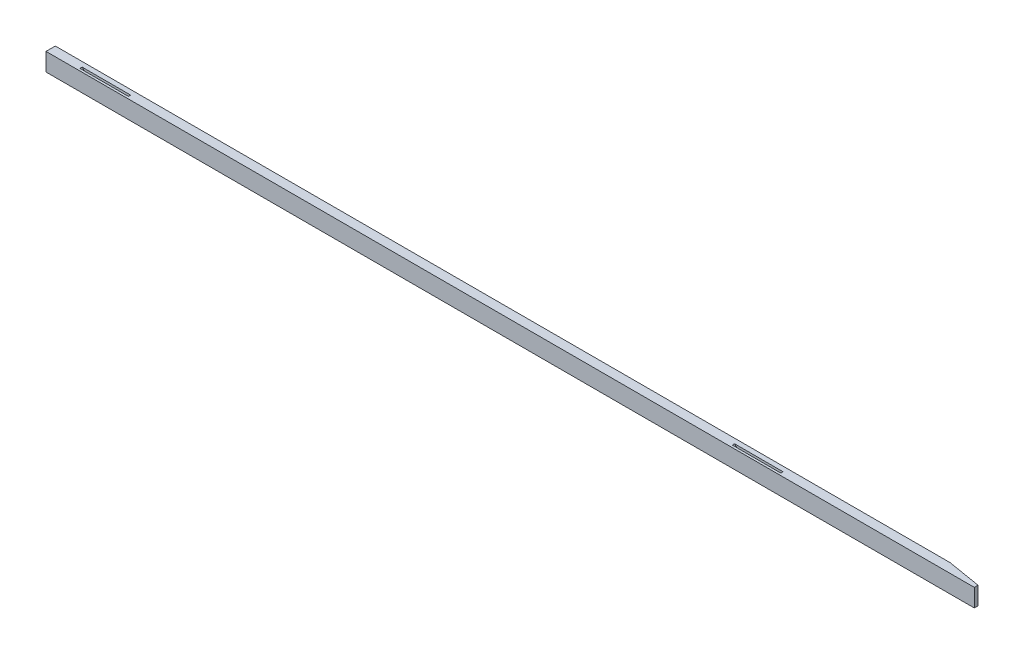
ISO-10303-21;
HEADER;
FILE_DESCRIPTION(('STEP AP214'),'2;1');
FILE_NAME('part.step','',(''),(''),'','','');
FILE_SCHEMA(('AUTOMOTIVE_DESIGN { 1 0 10303 214 1 1 1 1 }'));
ENDSEC;
DATA;
#1=APPLICATION_CONTEXT('core data for automotive mechanical design processes');
#2=APPLICATION_PROTOCOL_DEFINITION('international standard','automotive_design',2000,#1);
#3=PRODUCT_CONTEXT('',#1,'mechanical');
#4=PRODUCT('Part','Part','',(#3));
#5=PRODUCT_RELATED_PRODUCT_CATEGORY('part','',(#4));
#6=PRODUCT_DEFINITION_FORMATION('','',#4);
#7=PRODUCT_DEFINITION_CONTEXT('part definition',#1,'design');
#8=PRODUCT_DEFINITION('design','',#6,#7);
#9=PRODUCT_DEFINITION_SHAPE('','',#8);
#10=(LENGTH_UNIT() NAMED_UNIT(*) SI_UNIT(.MILLI.,.METRE.));
#11=(NAMED_UNIT(*) PLANE_ANGLE_UNIT() SI_UNIT($,.RADIAN.));
#12=(NAMED_UNIT(*) SI_UNIT($,.STERADIAN.) SOLID_ANGLE_UNIT());
#13=UNCERTAINTY_MEASURE_WITH_UNIT(LENGTH_MEASURE(1.E-05),#10,'distance_accuracy_value','');
#14=(GEOMETRIC_REPRESENTATION_CONTEXT(3) GLOBAL_UNCERTAINTY_ASSIGNED_CONTEXT((#13)) GLOBAL_UNIT_ASSIGNED_CONTEXT((#10,
#11,#12)) REPRESENTATION_CONTEXT('',''));
#15=CARTESIAN_POINT('',(0.,0.,0.));
#16=DIRECTION('',(0.,0.,1.));
#17=DIRECTION('',(1.,0.,0.));
#18=AXIS2_PLACEMENT_3D('',#15,#16,#17);
#19=CARTESIAN_POINT('',(92.5000000000005,-16.5000000000011,19.));
#20=DIRECTION('',(0.,0.,1.));
#21=DIRECTION('',(1.,0.,0.));
#22=AXIS2_PLACEMENT_3D('',#19,#20,#21);
#23=PLANE('',#22);
#24=DIRECTION('',(1.,0.,0.));
#25=VECTOR('',#24,1.);
#26=CARTESIAN_POINT('',(92.5000000000005,-24.0000000000011,19.));
#27=LINE('',#26,#25);
#28=CARTESIAN_POINT('',(85.0000000000004,-24.0000000000011,19.));
#29=VERTEX_POINT('',#28);
#30=CARTESIAN_POINT('',(215.000000000001,-24.0000000000011,19.));
#31=VERTEX_POINT('',#30);
#32=EDGE_CURVE('E11',#29,#31,#27,.T.);
#33=ORIENTED_EDGE('',*,*,#32,.F.);
#34=DIRECTION('',(0.707106781186549,0.707106781186546,0.));
#35=VECTOR('',#34,1.);
#36=CARTESIAN_POINT('',(92.5000000000005,-16.5000000000011,19.));
#37=LINE('',#36,#35);
#38=CARTESIAN_POINT('',(92.5000000000005,-16.5000000000011,19.));
#39=VERTEX_POINT('',#38);
#40=EDGE_CURVE('E312',#39,#29,#37,.F.);
#41=ORIENTED_EDGE('',*,*,#40,.F.);
#42=DIRECTION('',(1.,0.,0.));
#43=VECTOR('',#42,1.);
#44=CARTESIAN_POINT('',(92.5000000000005,-16.5000000000011,19.));
#45=LINE('',#44,#43);
#46=CARTESIAN_POINT('',(207.5,-16.5000000000011,19.));
#47=VERTEX_POINT('',#46);
#48=EDGE_CURVE('E321',#39,#47,#45,.T.);
#49=ORIENTED_EDGE('',*,*,#48,.T.);
#50=DIRECTION('',(-0.707106781186549,0.707106781186546,0.));
#51=VECTOR('',#50,1.);
#52=CARTESIAN_POINT('',(150.,40.9999999999989,19.));
#53=LINE('',#52,#51);
#54=EDGE_CURVE('E42',#47,#31,#53,.F.);
#55=ORIENTED_EDGE('',*,*,#54,.T.);
#56=EDGE_LOOP('',(#33,#41,#49,#55));
#57=FACE_BOUND('',#56,.T.);
#58=ADVANCED_FACE('F35',(#57),#23,.F.);
#59=CARTESIAN_POINT('',(207.5,-16.5000000000011,19.));
#60=DIRECTION('',(-0.707106781186546,-0.707106781186549,0.));
#61=DIRECTION('',(-0.707106781186549,0.707106781186546,0.));
#62=AXIS2_PLACEMENT_3D('',#59,#60,#61);
#63=PLANE('',#62);
#64=DIRECTION('',(0.,0.,1.));
#65=VECTOR('',#64,1.);
#66=CARTESIAN_POINT('',(215.000000000001,-24.0000000000011,19.));
#67=LINE('',#66,#65);
#68=CARTESIAN_POINT('',(215.000000000001,-24.0000000000011,13.));
#69=VERTEX_POINT('',#68);
#70=EDGE_CURVE('E57',#31,#69,#67,.F.);
#71=ORIENTED_EDGE('',*,*,#70,.F.);
#72=ORIENTED_EDGE('',*,*,#54,.F.);
#73=DIRECTION('',(0.,0.,-1.));
#74=VECTOR('',#73,1.);
#75=CARTESIAN_POINT('',(207.5,-16.5000000000011,19.));
#76=LINE('',#75,#74);
#77=CARTESIAN_POINT('',(207.5,-16.5000000000011,13.));
#78=VERTEX_POINT('',#77);
#79=EDGE_CURVE('E318',#47,#78,#76,.T.);
#80=ORIENTED_EDGE('',*,*,#79,.T.);
#81=DIRECTION('',(-0.707106781186549,0.707106781186546,0.));
#82=VECTOR('',#81,1.);
#83=CARTESIAN_POINT('',(207.5,-16.5000000000011,13.));
#84=LINE('',#83,#82);
#85=EDGE_CURVE('E327',#78,#69,#84,.F.);
#86=ORIENTED_EDGE('',*,*,#85,.T.);
#87=EDGE_LOOP('',(#71,#72,#80,#86));
#88=FACE_BOUND('',#87,.T.);
#89=ADVANCED_FACE('F342',(#88),#63,.T.);
#90=CARTESIAN_POINT('',(207.5,-16.5000000000011,13.));
#91=DIRECTION('',(0.,0.,-1.));
#92=DIRECTION('',(-1.,0.,0.));
#93=AXIS2_PLACEMENT_3D('',#90,#91,#92);
#94=PLANE('',#93);
#95=DIRECTION('',(-1.,0.,0.));
#96=VECTOR('',#95,1.);
#97=CARTESIAN_POINT('',(207.5,-24.0000000000011,13.));
#98=LINE('',#97,#96);
#99=CARTESIAN_POINT('',(85.0000000000004,-24.0000000000011,13.));
#100=VERTEX_POINT('',#99);
#101=EDGE_CURVE('E324',#69,#100,#98,.T.);
#102=ORIENTED_EDGE('',*,*,#101,.F.);
#103=ORIENTED_EDGE('',*,*,#85,.F.);
#104=DIRECTION('',(-1.,0.,0.));
#105=VECTOR('',#104,1.);
#106=CARTESIAN_POINT('',(207.5,-16.5000000000011,13.));
#107=LINE('',#106,#105);
#108=CARTESIAN_POINT('',(92.5000000000005,-16.5000000000011,13.));
#109=VERTEX_POINT('',#108);
#110=EDGE_CURVE('E315',#78,#109,#107,.T.);
#111=ORIENTED_EDGE('',*,*,#110,.T.);
#112=DIRECTION('',(0.707106781186549,0.707106781186546,0.));
#113=VECTOR('',#112,1.);
#114=CARTESIAN_POINT('',(150.000000000001,40.9999999999989,13.));
#115=LINE('',#114,#113);
#116=EDGE_CURVE('E307',#109,#100,#115,.F.);
#117=ORIENTED_EDGE('',*,*,#116,.T.);
#118=EDGE_LOOP('',(#102,#103,#111,#117));
#119=FACE_BOUND('',#118,.T.);
#120=ADVANCED_FACE('F344',(#119),#94,.F.);
#121=CARTESIAN_POINT('',(-1750.,-16.5000000000006,0.));
#122=DIRECTION('',(0.,-1.,0.));
#123=DIRECTION('',(-1.,0.,0.));
#124=AXIS2_PLACEMENT_3D('',#121,#122,#123);
#125=PLANE('',#124);
#126=ORIENTED_EDGE('',*,*,#110,.F.);
#127=ORIENTED_EDGE('',*,*,#79,.F.);
#128=ORIENTED_EDGE('',*,*,#48,.F.);
#129=DIRECTION('',(0.,0.,1.));
#130=VECTOR('',#129,1.);
#131=CARTESIAN_POINT('',(92.5000000000005,-16.5000000000011,13.));
#132=LINE('',#131,#130);
#133=EDGE_CURVE('E310',#109,#39,#132,.T.);
#134=ORIENTED_EDGE('',*,*,#133,.F.);
#135=EDGE_LOOP('',(#126,#127,#128,#134));
#136=FACE_BOUND('',#135,.T.);
#137=ADVANCED_FACE('F340',(#136),#125,.T.);
#138=CARTESIAN_POINT('',(92.5000000000005,-16.5000000000011,13.));
#139=DIRECTION('',(0.707106781186546,-0.707106781186549,0.));
#140=DIRECTION('',(-0.707106781186549,-0.707106781186546,0.));
#141=AXIS2_PLACEMENT_3D('',#138,#139,#140);
#142=PLANE('',#141);
#143=DIRECTION('',(0.,0.,-1.));
#144=VECTOR('',#143,1.);
#145=CARTESIAN_POINT('',(85.0000000000004,-24.0000000000011,13.));
#146=LINE('',#145,#144);
#147=EDGE_CURVE('E305',#100,#29,#146,.F.);
#148=ORIENTED_EDGE('',*,*,#147,.F.);
#149=ORIENTED_EDGE('',*,*,#116,.F.);
#150=ORIENTED_EDGE('',*,*,#133,.T.);
#151=ORIENTED_EDGE('',*,*,#40,.T.);
#152=EDGE_LOOP('',(#148,#149,#150,#151));
#153=FACE_BOUND('',#152,.T.);
#154=ADVANCED_FACE('F337',(#153),#142,.T.);
#155=CARTESIAN_POINT('',(207.5,16.5000000000002,13.));
#156=DIRECTION('',(0.,0.,-1.));
#157=DIRECTION('',(-1.,0.,0.));
#158=AXIS2_PLACEMENT_3D('',#155,#156,#157);
#159=PLANE('',#158);
#160=DIRECTION('',(-1.,0.,0.));
#161=VECTOR('',#160,1.);
#162=CARTESIAN_POINT('',(207.5,24.0000000000002,13.));
#163=LINE('',#162,#161);
#164=CARTESIAN_POINT('',(215.000000000001,24.0000000000002,13.));
#165=VERTEX_POINT('',#164);
#166=CARTESIAN_POINT('',(85.0000000000004,24.0000000000001,13.));
#167=VERTEX_POINT('',#166);
#168=EDGE_CURVE('E302',#165,#167,#163,.T.);
#169=ORIENTED_EDGE('',*,*,#168,.T.);
#170=DIRECTION('',(0.707106781186549,-0.707106781186546,0.));
#171=VECTOR('',#170,1.);
#172=CARTESIAN_POINT('',(150.000000000001,-40.9999999999999,13.));
#173=LINE('',#172,#171);
#174=CARTESIAN_POINT('',(92.5000000000005,16.5000000000001,13.));
#175=VERTEX_POINT('',#174);
#176=EDGE_CURVE('E288',#175,#167,#173,.F.);
#177=ORIENTED_EDGE('',*,*,#176,.F.);
#178=DIRECTION('',(-1.,0.,0.));
#179=VECTOR('',#178,1.);
#180=CARTESIAN_POINT('',(207.5,16.5000000000002,13.));
#181=LINE('',#180,#179);
#182=CARTESIAN_POINT('',(207.5,16.5000000000002,13.));
#183=VERTEX_POINT('',#182);
#184=EDGE_CURVE('E291',#183,#175,#181,.T.);
#185=ORIENTED_EDGE('',*,*,#184,.F.);
#186=DIRECTION('',(-0.707106781186549,-0.707106781186546,0.));
#187=VECTOR('',#186,1.);
#188=CARTESIAN_POINT('',(207.5,16.5000000000002,13.));
#189=LINE('',#188,#187);
#190=EDGE_CURVE('E299',#183,#165,#189,.F.);
#191=ORIENTED_EDGE('',*,*,#190,.T.);
#192=EDGE_LOOP('',(#169,#177,#185,#191));
#193=FACE_BOUND('',#192,.T.);
#194=ADVANCED_FACE('F379',(#193),#159,.F.);
#195=CARTESIAN_POINT('',(207.5,16.5000000000002,19.));
#196=DIRECTION('',(-0.707106781186546,0.707106781186549,0.));
#197=DIRECTION('',(-0.707106781186549,-0.707106781186546,0.));
#198=AXIS2_PLACEMENT_3D('',#195,#196,#197);
#199=PLANE('',#198);
#200=DIRECTION('',(0.,0.,1.));
#201=VECTOR('',#200,1.);
#202=CARTESIAN_POINT('',(215.000000000001,24.0000000000002,19.));
#203=LINE('',#202,#201);
#204=CARTESIAN_POINT('',(215.000000000001,24.0000000000002,19.));
#205=VERTEX_POINT('',#204);
#206=EDGE_CURVE('E297',#205,#165,#203,.F.);
#207=ORIENTED_EDGE('',*,*,#206,.T.);
#208=ORIENTED_EDGE('',*,*,#190,.F.);
#209=DIRECTION('',(0.,0.,-1.));
#210=VECTOR('',#209,1.);
#211=CARTESIAN_POINT('',(207.5,16.5000000000002,19.));
#212=LINE('',#211,#210);
#213=CARTESIAN_POINT('',(207.5,16.5000000000002,19.));
#214=VERTEX_POINT('',#213);
#215=EDGE_CURVE('E294',#214,#183,#212,.T.);
#216=ORIENTED_EDGE('',*,*,#215,.F.);
#217=DIRECTION('',(-0.707106781186549,-0.707106781186546,0.));
#218=VECTOR('',#217,1.);
#219=CARTESIAN_POINT('',(150.,-40.9999999999999,19.));
#220=LINE('',#219,#218);
#221=EDGE_CURVE('E273',#214,#205,#220,.F.);
#222=ORIENTED_EDGE('',*,*,#221,.T.);
#223=EDGE_LOOP('',(#207,#208,#216,#222));
#224=FACE_BOUND('',#223,.T.);
#225=ADVANCED_FACE('F388',(#224),#199,.T.);
#226=CARTESIAN_POINT('',(-1750.,16.4999999999996,0.));
#227=DIRECTION('',(0.,1.,0.));
#228=DIRECTION('',(-1.,0.,0.));
#229=AXIS2_PLACEMENT_3D('',#226,#227,#228);
#230=PLANE('',#229);
#231=ORIENTED_EDGE('',*,*,#184,.T.);
#232=DIRECTION('',(0.,0.,1.));
#233=VECTOR('',#232,1.);
#234=CARTESIAN_POINT('',(92.5000000000005,16.5000000000001,13.));
#235=LINE('',#234,#233);
#236=CARTESIAN_POINT('',(92.5000000000005,16.5000000000001,19.));
#237=VERTEX_POINT('',#236);
#238=EDGE_CURVE('E285',#175,#237,#235,.T.);
#239=ORIENTED_EDGE('',*,*,#238,.T.);
#240=DIRECTION('',(1.,0.,0.));
#241=VECTOR('',#240,1.);
#242=CARTESIAN_POINT('',(92.5000000000005,16.5000000000001,19.));
#243=LINE('',#242,#241);
#244=EDGE_CURVE('E276',#237,#214,#243,.T.);
#245=ORIENTED_EDGE('',*,*,#244,.T.);
#246=ORIENTED_EDGE('',*,*,#215,.T.);
#247=EDGE_LOOP('',(#231,#239,#245,#246));
#248=FACE_BOUND('',#247,.T.);
#249=ADVANCED_FACE('F398',(#248),#230,.T.);
#250=CARTESIAN_POINT('',(92.5000000000005,16.5000000000001,13.));
#251=DIRECTION('',(0.707106781186546,0.707106781186549,0.));
#252=DIRECTION('',(-0.707106781186549,0.707106781186546,0.));
#253=AXIS2_PLACEMENT_3D('',#250,#251,#252);
#254=PLANE('',#253);
#255=DIRECTION('',(0.,0.,-1.));
#256=VECTOR('',#255,1.);
#257=CARTESIAN_POINT('',(85.0000000000004,24.0000000000001,13.));
#258=LINE('',#257,#256);
#259=CARTESIAN_POINT('',(85.0000000000004,24.0000000000001,19.));
#260=VERTEX_POINT('',#259);
#261=EDGE_CURVE('E282',#167,#260,#258,.F.);
#262=ORIENTED_EDGE('',*,*,#261,.T.);
#263=DIRECTION('',(0.707106781186549,-0.707106781186546,0.));
#264=VECTOR('',#263,1.);
#265=CARTESIAN_POINT('',(92.5000000000005,16.5000000000001,19.));
#266=LINE('',#265,#264);
#267=EDGE_CURVE('E279',#237,#260,#266,.F.);
#268=ORIENTED_EDGE('',*,*,#267,.F.);
#269=ORIENTED_EDGE('',*,*,#238,.F.);
#270=ORIENTED_EDGE('',*,*,#176,.T.);
#271=EDGE_LOOP('',(#262,#268,#269,#270));
#272=FACE_BOUND('',#271,.T.);
#273=ADVANCED_FACE('F408',(#272),#254,.T.);
#274=CARTESIAN_POINT('',(92.5000000000005,16.5000000000001,19.));
#275=DIRECTION('',(0.,0.,1.));
#276=DIRECTION('',(1.,0.,0.));
#277=AXIS2_PLACEMENT_3D('',#274,#275,#276);
#278=PLANE('',#277);
#279=DIRECTION('',(1.,0.,0.));
#280=VECTOR('',#279,1.);
#281=CARTESIAN_POINT('',(92.5000000000005,24.0000000000001,19.));
#282=LINE('',#281,#280);
#283=EDGE_CURVE('E271',#260,#205,#282,.T.);
#284=ORIENTED_EDGE('',*,*,#283,.T.);
#285=ORIENTED_EDGE('',*,*,#221,.F.);
#286=ORIENTED_EDGE('',*,*,#244,.F.);
#287=ORIENTED_EDGE('',*,*,#267,.T.);
#288=EDGE_LOOP('',(#284,#285,#286,#287));
#289=FACE_BOUND('',#288,.T.);
#290=ADVANCED_FACE('F418',(#289),#278,.F.);
#291=CARTESIAN_POINT('',(0.,-16.5000000000001,0.));
#292=DIRECTION('',(0.,-1.,0.));
#293=DIRECTION('',(-1.,0.,0.));
#294=AXIS2_PLACEMENT_3D('',#291,#292,#293);
#295=PLANE('',#294);
#296=DIRECTION('',(-1.,0.,0.));
#297=VECTOR('',#296,1.);
#298=CARTESIAN_POINT('',(1957.5,-16.5000000000006,13.));
#299=LINE('',#298,#297);
#300=CARTESIAN_POINT('',(1957.5,-16.5000000000006,13.));
#301=VERTEX_POINT('',#300);
#302=CARTESIAN_POINT('',(1842.5,-16.5000000000006,13.));
#303=VERTEX_POINT('',#302);
#304=EDGE_CURVE('E264',#301,#303,#299,.T.);
#305=ORIENTED_EDGE('',*,*,#304,.F.);
#306=DIRECTION('',(0.,0.,-1.));
#307=VECTOR('',#306,1.);
#308=CARTESIAN_POINT('',(1957.5,-16.5000000000006,19.));
#309=LINE('',#308,#307);
#310=CARTESIAN_POINT('',(1957.5,-16.5000000000006,19.));
#311=VERTEX_POINT('',#310);
#312=EDGE_CURVE('E255',#311,#301,#309,.T.);
#313=ORIENTED_EDGE('',*,*,#312,.F.);
#314=DIRECTION('',(1.,0.,0.));
#315=VECTOR('',#314,1.);
#316=CARTESIAN_POINT('',(1842.5,-16.5000000000006,19.));
#317=LINE('',#316,#315);
#318=CARTESIAN_POINT('',(1842.5,-16.5000000000006,19.));
#319=VERTEX_POINT('',#318);
#320=EDGE_CURVE('E243',#319,#311,#317,.T.);
#321=ORIENTED_EDGE('',*,*,#320,.F.);
#322=DIRECTION('',(0.,0.,1.));
#323=VECTOR('',#322,1.);
#324=CARTESIAN_POINT('',(1842.5,-16.5000000000006,13.));
#325=LINE('',#324,#323);
#326=EDGE_CURVE('E269',#303,#319,#325,.T.);
#327=ORIENTED_EDGE('',*,*,#326,.F.);
#328=EDGE_LOOP('',(#305,#313,#321,#327));
#329=FACE_BOUND('',#328,.T.);
#330=ADVANCED_FACE('F428',(#329),#295,.T.);
#331=CARTESIAN_POINT('',(1842.5,-16.5000000000006,13.));
#332=DIRECTION('',(0.707106781186546,-0.707106781186549,0.));
#333=DIRECTION('',(-0.707106781186549,-0.707106781186546,0.));
#334=AXIS2_PLACEMENT_3D('',#331,#332,#333);
#335=PLANE('',#334);
#336=DIRECTION('',(0.,0.,-1.));
#337=VECTOR('',#336,1.);
#338=CARTESIAN_POINT('',(1835.,-24.0000000000006,13.));
#339=LINE('',#338,#337);
#340=CARTESIAN_POINT('',(1835.,-24.0000000000006,13.));
#341=VERTEX_POINT('',#340);
#342=CARTESIAN_POINT('',(1835.,-24.0000000000006,19.));
#343=VERTEX_POINT('',#342);
#344=EDGE_CURVE('E267',#341,#343,#339,.F.);
#345=ORIENTED_EDGE('',*,*,#344,.F.);
#346=DIRECTION('',(0.707106781186549,0.707106781186546,0.));
#347=VECTOR('',#346,1.);
#348=CARTESIAN_POINT('',(1900.,40.9999999999994,13.));
#349=LINE('',#348,#347);
#350=EDGE_CURVE('E261',#303,#341,#349,.F.);
#351=ORIENTED_EDGE('',*,*,#350,.F.);
#352=ORIENTED_EDGE('',*,*,#326,.T.);
#353=DIRECTION('',(0.707106781186549,0.707106781186546,0.));
#354=VECTOR('',#353,1.);
#355=CARTESIAN_POINT('',(1842.5,-16.5000000000006,19.));
#356=LINE('',#355,#354);
#357=EDGE_CURVE('E246',#319,#343,#356,.F.);
#358=ORIENTED_EDGE('',*,*,#357,.T.);
#359=EDGE_LOOP('',(#345,#351,#352,#358));
#360=FACE_BOUND('',#359,.T.);
#361=ADVANCED_FACE('F541',(#360),#335,.T.);
#362=CARTESIAN_POINT('',(1957.5,-16.5000000000006,13.));
#363=DIRECTION('',(0.,0.,-1.));
#364=DIRECTION('',(-1.,0.,0.));
#365=AXIS2_PLACEMENT_3D('',#362,#363,#364);
#366=PLANE('',#365);
#367=DIRECTION('',(-1.,0.,0.));
#368=VECTOR('',#367,1.);
#369=CARTESIAN_POINT('',(1957.5,-24.0000000000006,13.));
#370=LINE('',#369,#368);
#371=CARTESIAN_POINT('',(1965.,-24.0000000000006,13.));
#372=VERTEX_POINT('',#371);
#373=EDGE_CURVE('E258',#372,#341,#370,.T.);
#374=ORIENTED_EDGE('',*,*,#373,.F.);
#375=DIRECTION('',(-0.707106781186549,0.707106781186546,0.));
#376=VECTOR('',#375,1.);
#377=CARTESIAN_POINT('',(1957.5,-16.5000000000006,13.));
#378=LINE('',#377,#376);
#379=EDGE_CURVE('E252',#301,#372,#378,.F.);
#380=ORIENTED_EDGE('',*,*,#379,.F.);
#381=ORIENTED_EDGE('',*,*,#304,.T.);
#382=ORIENTED_EDGE('',*,*,#350,.T.);
#383=EDGE_LOOP('',(#374,#380,#381,#382));
#384=FACE_BOUND('',#383,.T.);
#385=ADVANCED_FACE('F550',(#384),#366,.F.);
#386=CARTESIAN_POINT('',(1957.5,-16.5000000000006,19.));
#387=DIRECTION('',(-0.707106781186546,-0.707106781186549,0.));
#388=DIRECTION('',(-0.707106781186549,0.707106781186546,0.));
#389=AXIS2_PLACEMENT_3D('',#386,#387,#388);
#390=PLANE('',#389);
#391=DIRECTION('',(0.,0.,1.));
#392=VECTOR('',#391,1.);
#393=CARTESIAN_POINT('',(1965.,-24.0000000000006,19.));
#394=LINE('',#393,#392);
#395=CARTESIAN_POINT('',(1965.,-24.0000000000006,19.));
#396=VERTEX_POINT('',#395);
#397=EDGE_CURVE('E249',#396,#372,#394,.F.);
#398=ORIENTED_EDGE('',*,*,#397,.F.);
#399=DIRECTION('',(-0.707106781186549,0.707106781186546,0.));
#400=VECTOR('',#399,1.);
#401=CARTESIAN_POINT('',(1900.,40.9999999999994,19.));
#402=LINE('',#401,#400);
#403=EDGE_CURVE('E240',#311,#396,#402,.F.);
#404=ORIENTED_EDGE('',*,*,#403,.F.);
#405=ORIENTED_EDGE('',*,*,#312,.T.);
#406=ORIENTED_EDGE('',*,*,#379,.T.);
#407=EDGE_LOOP('',(#398,#404,#405,#406));
#408=FACE_BOUND('',#407,.T.);
#409=ADVANCED_FACE('F559',(#408),#390,.T.);
#410=CARTESIAN_POINT('',(1842.5,-16.5000000000006,19.));
#411=DIRECTION('',(0.,0.,1.));
#412=DIRECTION('',(1.,0.,0.));
#413=AXIS2_PLACEMENT_3D('',#410,#411,#412);
#414=PLANE('',#413);
#415=DIRECTION('',(1.,0.,0.));
#416=VECTOR('',#415,1.);
#417=CARTESIAN_POINT('',(1842.5,-24.0000000000006,19.));
#418=LINE('',#417,#416);
#419=EDGE_CURVE('E221',#343,#396,#418,.T.);
#420=ORIENTED_EDGE('',*,*,#419,.F.);
#421=ORIENTED_EDGE('',*,*,#357,.F.);
#422=ORIENTED_EDGE('',*,*,#320,.T.);
#423=ORIENTED_EDGE('',*,*,#403,.T.);
#424=EDGE_LOOP('',(#420,#421,#422,#423));
#425=FACE_BOUND('',#424,.T.);
#426=ADVANCED_FACE('F441',(#425),#414,.F.);
#427=CARTESIAN_POINT('',(2490.,24.0000000000008,25.));
#428=DIRECTION('',(0.,-1.,0.));
#429=DIRECTION('',(1.,0.,0.));
#430=AXIS2_PLACEMENT_3D('',#427,#428,#429);
#431=PLANE('',#430);
#432=ORIENTED_EDGE('',*,*,#261,.F.);
#433=ORIENTED_EDGE('',*,*,#168,.F.);
#434=ORIENTED_EDGE('',*,*,#206,.F.);
#435=ORIENTED_EDGE('',*,*,#283,.F.);
#436=EDGE_LOOP('',(#432,#433,#434,#435));
#437=FACE_BOUND('',#436,.T.);
#438=DIRECTION('',(0.,0.,-1.));
#439=VECTOR('',#438,1.);
#440=CARTESIAN_POINT('',(1835.,24.0000000000006,13.));
#441=LINE('',#440,#439);
#442=CARTESIAN_POINT('',(1835.,24.0000000000006,13.));
#443=VERTEX_POINT('',#442);
#444=CARTESIAN_POINT('',(1835.,24.0000000000006,19.));
#445=VERTEX_POINT('',#444);
#446=EDGE_CURVE('E229',#443,#445,#441,.F.);
#447=ORIENTED_EDGE('',*,*,#446,.F.);
#448=DIRECTION('',(-1.,0.,0.));
#449=VECTOR('',#448,1.);
#450=CARTESIAN_POINT('',(1957.5,24.0000000000006,13.));
#451=LINE('',#450,#449);
#452=CARTESIAN_POINT('',(1965.,24.0000000000006,13.));
#453=VERTEX_POINT('',#452);
#454=EDGE_CURVE('E232',#453,#443,#451,.T.);
#455=ORIENTED_EDGE('',*,*,#454,.F.);
#456=DIRECTION('',(0.,0.,1.));
#457=VECTOR('',#456,1.);
#458=CARTESIAN_POINT('',(1965.,24.0000000000006,19.));
#459=LINE('',#458,#457);
#460=CARTESIAN_POINT('',(1965.,24.0000000000006,19.));
#461=VERTEX_POINT('',#460);
#462=EDGE_CURVE('E222',#461,#453,#459,.F.);
#463=ORIENTED_EDGE('',*,*,#462,.F.);
#464=DIRECTION('',(1.,0.,0.));
#465=VECTOR('',#464,1.);
#466=CARTESIAN_POINT('',(1842.5,24.0000000000006,19.));
#467=LINE('',#466,#465);
#468=EDGE_CURVE('E226',#445,#461,#467,.T.);
#469=ORIENTED_EDGE('',*,*,#468,.F.);
#470=EDGE_LOOP('',(#447,#455,#463,#469));
#471=FACE_BOUND('',#470,.T.);
#472=DIRECTION('',(0.,0.,-1.));
#473=VECTOR('',#472,1.);
#474=CARTESIAN_POINT('',(2490.,24.0000000000008,25.));
#475=LINE('',#474,#473);
#476=CARTESIAN_POINT('',(2490.,24.0000000000008,25.));
#477=VERTEX_POINT('',#476);
#478=CARTESIAN_POINT('',(2490.,24.0000000000008,15.));
#479=VERTEX_POINT('',#478);
#480=EDGE_CURVE('E195',#477,#479,#475,.T.);
#481=ORIENTED_EDGE('',*,*,#480,.T.);
#482=DIRECTION('',(0.986393923832144,0.,0.164398987305358));
#483=VECTOR('',#482,1.);
#484=CARTESIAN_POINT('',(2490.,24.0000000000008,15.));
#485=LINE('',#484,#483);
#486=CARTESIAN_POINT('',(2400.,24.0000000000007,0.));
#487=VERTEX_POINT('',#486);
#488=EDGE_CURVE('E179',#487,#479,#485,.T.);
#489=ORIENTED_EDGE('',*,*,#488,.F.);
#490=DIRECTION('',(-1.,0.,0.));
#491=VECTOR('',#490,1.);
#492=CARTESIAN_POINT('',(2490.,24.0000000000008,0.));
#493=LINE('',#492,#491);
#494=CARTESIAN_POINT('',(0.,24.0000000000001,0.));
#495=VERTEX_POINT('',#494);
#496=EDGE_CURVE('E191',#487,#495,#493,.T.);
#497=ORIENTED_EDGE('',*,*,#496,.T.);
#498=DIRECTION('',(0.,0.,-1.));
#499=VECTOR('',#498,1.);
#500=CARTESIAN_POINT('',(0.,24.0000000000001,25.));
#501=LINE('',#500,#499);
#502=CARTESIAN_POINT('',(0.,24.0000000000001,25.));
#503=VERTEX_POINT('',#502);
#504=EDGE_CURVE('E219',#503,#495,#501,.T.);
#505=ORIENTED_EDGE('',*,*,#504,.F.);
#506=DIRECTION('',(-1.,0.,0.));
#507=VECTOR('',#506,1.);
#508=CARTESIAN_POINT('',(2490.,24.0000000000008,25.));
#509=LINE('',#508,#507);
#510=EDGE_CURVE('E211',#477,#503,#509,.T.);
#511=ORIENTED_EDGE('',*,*,#510,.F.);
#512=EDGE_LOOP('',(#481,#489,#497,#505,#511));
#513=FACE_BOUND('',#512,.T.);
#514=ADVANCED_FACE('F189',(#437,#471,#513),#431,.F.);
#515=CARTESIAN_POINT('',(0.,24.0000000000001,25.));
#516=DIRECTION('',(1.,0.,0.));
#517=DIRECTION('',(0.,0.,-1.));
#518=AXIS2_PLACEMENT_3D('',#515,#516,#517);
#519=PLANE('',#518);
#520=DIRECTION('',(0.,-1.,0.));
#521=VECTOR('',#520,1.);
#522=CARTESIAN_POINT('',(0.,24.0000000000001,0.));
#523=LINE('',#522,#521);
#524=CARTESIAN_POINT('',(0.,-23.9999999999999,0.));
#525=VERTEX_POINT('',#524);
#526=EDGE_CURVE('E198',#495,#525,#523,.T.);
#527=ORIENTED_EDGE('',*,*,#526,.T.);
#528=DIRECTION('',(0.,0.,-1.));
#529=VECTOR('',#528,1.);
#530=CARTESIAN_POINT('',(0.,-23.9999999999999,25.));
#531=LINE('',#530,#529);
#532=CARTESIAN_POINT('',(0.,-23.9999999999999,25.));
#533=VERTEX_POINT('',#532);
#534=EDGE_CURVE('E216',#533,#525,#531,.T.);
#535=ORIENTED_EDGE('',*,*,#534,.F.);
#536=DIRECTION('',(0.,-1.,0.));
#537=VECTOR('',#536,1.);
#538=CARTESIAN_POINT('',(0.,24.0000000000001,25.));
#539=LINE('',#538,#537);
#540=EDGE_CURVE('E590',#503,#533,#539,.T.);
#541=ORIENTED_EDGE('',*,*,#540,.F.);
#542=ORIENTED_EDGE('',*,*,#504,.T.);
#543=EDGE_LOOP('',(#527,#535,#541,#542));
#544=FACE_BOUND('',#543,.T.);
#545=ADVANCED_FACE('F440',(#544),#519,.F.);
#546=CARTESIAN_POINT('',(0.,-23.9999999999999,25.));
#547=DIRECTION('',(0.,1.,0.));
#548=DIRECTION('',(-1.,0.,0.));
#549=AXIS2_PLACEMENT_3D('',#546,#547,#548);
#550=PLANE('',#549);
#551=ORIENTED_EDGE('',*,*,#147,.T.);
#552=ORIENTED_EDGE('',*,*,#32,.T.);
#553=ORIENTED_EDGE('',*,*,#70,.T.);
#554=ORIENTED_EDGE('',*,*,#101,.T.);
#555=EDGE_LOOP('',(#551,#552,#553,#554));
#556=FACE_BOUND('',#555,.T.);
#557=ORIENTED_EDGE('',*,*,#344,.T.);
#558=ORIENTED_EDGE('',*,*,#419,.T.);
#559=ORIENTED_EDGE('',*,*,#397,.T.);
#560=ORIENTED_EDGE('',*,*,#373,.T.);
#561=EDGE_LOOP('',(#557,#558,#559,#560));
#562=FACE_BOUND('',#561,.T.);
#563=DIRECTION('',(1.,0.,0.));
#564=VECTOR('',#563,1.);
#565=CARTESIAN_POINT('',(0.,-23.9999999999999,0.));
#566=LINE('',#565,#564);
#567=CARTESIAN_POINT('',(2400.,-23.9999999999991,0.));
#568=VERTEX_POINT('',#567);
#569=EDGE_CURVE('E202',#525,#568,#566,.T.);
#570=ORIENTED_EDGE('',*,*,#569,.T.);
#571=DIRECTION('',(-0.986393923832144,0.,-0.164398987305358));
#572=VECTOR('',#571,1.);
#573=CARTESIAN_POINT('',(2490.,-23.999999999999,15.));
#574=LINE('',#573,#572);
#575=CARTESIAN_POINT('',(2490.,-23.999999999999,15.));
#576=VERTEX_POINT('',#575);
#577=EDGE_CURVE('E49',#576,#568,#574,.T.);
#578=ORIENTED_EDGE('',*,*,#577,.F.);
#579=DIRECTION('',(0.,0.,-1.));
#580=VECTOR('',#579,1.);
#581=CARTESIAN_POINT('',(2490.,-23.999999999999,25.));
#582=LINE('',#581,#580);
#583=CARTESIAN_POINT('',(2490.,-23.999999999999,25.));
#584=VERTEX_POINT('',#583);
#585=EDGE_CURVE('E213',#584,#576,#582,.T.);
#586=ORIENTED_EDGE('',*,*,#585,.F.);
#587=DIRECTION('',(1.,0.,0.));
#588=VECTOR('',#587,1.);
#589=CARTESIAN_POINT('',(0.,-23.9999999999999,25.));
#590=LINE('',#589,#588);
#591=EDGE_CURVE('E595',#533,#584,#590,.T.);
#592=ORIENTED_EDGE('',*,*,#591,.F.);
#593=ORIENTED_EDGE('',*,*,#534,.T.);
#594=EDGE_LOOP('',(#570,#578,#586,#592,#593));
#595=FACE_BOUND('',#594,.T.);
#596=ADVANCED_FACE('F334',(#556,#562,#595),#550,.F.);
#597=CARTESIAN_POINT('',(2490.,-23.999999999999,25.));
#598=DIRECTION('',(-1.,0.,0.));
#599=DIRECTION('',(0.,0.,1.));
#600=AXIS2_PLACEMENT_3D('',#597,#598,#599);
#601=PLANE('',#600);
#602=ORIENTED_EDGE('',*,*,#585,.T.);
#603=DIRECTION('',(0.,-1.,0.));
#604=VECTOR('',#603,1.);
#605=CARTESIAN_POINT('',(2490.,24.0010000000016,15.));
#606=LINE('',#605,#604);
#607=EDGE_CURVE('E185',#479,#576,#606,.T.);
#608=ORIENTED_EDGE('',*,*,#607,.F.);
#609=ORIENTED_EDGE('',*,*,#480,.F.);
#610=DIRECTION('',(0.,1.,0.));
#611=VECTOR('',#610,1.);
#612=CARTESIAN_POINT('',(2490.,-23.999999999999,25.));
#613=LINE('',#612,#611);
#614=EDGE_CURVE('E207',#584,#477,#613,.T.);
#615=ORIENTED_EDGE('',*,*,#614,.F.);
#616=EDGE_LOOP('',(#602,#608,#609,#615));
#617=FACE_BOUND('',#616,.T.);
#618=ADVANCED_FACE('F454',(#617),#601,.F.);
#619=CARTESIAN_POINT('',(0.,0.,25.));
#620=DIRECTION('',(0.,0.,1.));
#621=DIRECTION('',(1.,0.,0.));
#622=AXIS2_PLACEMENT_3D('',#619,#620,#621);
#623=PLANE('',#622);
#624=ORIENTED_EDGE('',*,*,#510,.T.);
#625=ORIENTED_EDGE('',*,*,#540,.T.);
#626=ORIENTED_EDGE('',*,*,#591,.T.);
#627=ORIENTED_EDGE('',*,*,#614,.T.);
#628=EDGE_LOOP('',(#624,#625,#626,#627));
#629=FACE_BOUND('',#628,.T.);
#630=ADVANCED_FACE('F463',(#629),#623,.T.);
#631=CARTESIAN_POINT('',(0.,0.,0.));
#632=DIRECTION('',(0.,0.,1.));
#633=DIRECTION('',(1.,0.,0.));
#634=AXIS2_PLACEMENT_3D('',#631,#632,#633);
#635=PLANE('',#634);
#636=ORIENTED_EDGE('',*,*,#496,.F.);
#637=DIRECTION('',(0.,-1.,0.));
#638=VECTOR('',#637,1.);
#639=CARTESIAN_POINT('',(2400.,24.0010000000016,0.));
#640=LINE('',#639,#638);
#641=EDGE_CURVE('E176',#487,#568,#640,.T.);
#642=ORIENTED_EDGE('',*,*,#641,.T.);
#643=ORIENTED_EDGE('',*,*,#569,.F.);
#644=ORIENTED_EDGE('',*,*,#526,.F.);
#645=EDGE_LOOP('',(#636,#642,#643,#644));
#646=FACE_BOUND('',#645,.T.);
#647=ADVANCED_FACE('F197',(#646),#635,.F.);
#648=CARTESIAN_POINT('',(1957.5,16.5000000000006,13.));
#649=DIRECTION('',(0.,0.,-1.));
#650=DIRECTION('',(-1.,0.,0.));
#651=AXIS2_PLACEMENT_3D('',#648,#649,#650);
#652=PLANE('',#651);
#653=ORIENTED_EDGE('',*,*,#454,.T.);
#654=DIRECTION('',(0.707106781186549,-0.707106781186546,0.));
#655=VECTOR('',#654,1.);
#656=CARTESIAN_POINT('',(1900.,-40.9999999999994,13.));
#657=LINE('',#656,#655);
#658=CARTESIAN_POINT('',(1842.5,16.5000000000006,13.));
#659=VERTEX_POINT('',#658);
#660=EDGE_CURVE('E233',#659,#443,#657,.F.);
#661=ORIENTED_EDGE('',*,*,#660,.F.);
#662=DIRECTION('',(-1.,0.,0.));
#663=VECTOR('',#662,1.);
#664=CARTESIAN_POINT('',(1957.5,16.5000000000006,13.));
#665=LINE('',#664,#663);
#666=CARTESIAN_POINT('',(1957.5,16.5000000000006,13.));
#667=VERTEX_POINT('',#666);
#668=EDGE_CURVE('E225',#667,#659,#665,.T.);
#669=ORIENTED_EDGE('',*,*,#668,.F.);
#670=DIRECTION('',(-0.707106781186549,-0.707106781186546,0.));
#671=VECTOR('',#670,1.);
#672=CARTESIAN_POINT('',(1957.5,16.5000000000006,13.));
#673=LINE('',#672,#671);
#674=EDGE_CURVE('E200',#667,#453,#673,.F.);
#675=ORIENTED_EDGE('',*,*,#674,.T.);
#676=EDGE_LOOP('',(#653,#661,#669,#675));
#677=FACE_BOUND('',#676,.T.);
#678=ADVANCED_FACE('F475',(#677),#652,.F.);
#679=CARTESIAN_POINT('',(1957.5,16.5000000000006,19.));
#680=DIRECTION('',(-0.707106781186546,0.707106781186549,0.));
#681=DIRECTION('',(-0.707106781186549,-0.707106781186546,0.));
#682=AXIS2_PLACEMENT_3D('',#679,#680,#681);
#683=PLANE('',#682);
#684=ORIENTED_EDGE('',*,*,#462,.T.);
#685=ORIENTED_EDGE('',*,*,#674,.F.);
#686=DIRECTION('',(0.,0.,-1.));
#687=VECTOR('',#686,1.);
#688=CARTESIAN_POINT('',(1957.5,16.5000000000006,19.));
#689=LINE('',#688,#687);
#690=CARTESIAN_POINT('',(1957.5,16.5000000000006,19.));
#691=VERTEX_POINT('',#690);
#692=EDGE_CURVE('E236',#691,#667,#689,.T.);
#693=ORIENTED_EDGE('',*,*,#692,.F.);
#694=DIRECTION('',(-0.707106781186549,-0.707106781186546,0.));
#695=VECTOR('',#694,1.);
#696=CARTESIAN_POINT('',(1900.,-40.9999999999994,19.));
#697=LINE('',#696,#695);
#698=EDGE_CURVE('E204',#691,#461,#697,.F.);
#699=ORIENTED_EDGE('',*,*,#698,.T.);
#700=EDGE_LOOP('',(#684,#685,#693,#699));
#701=FACE_BOUND('',#700,.T.);
#702=ADVANCED_FACE('F512',(#701),#683,.T.);
#703=CARTESIAN_POINT('',(1842.5,16.5000000000006,19.));
#704=DIRECTION('',(0.,0.,1.));
#705=DIRECTION('',(1.,0.,0.));
#706=AXIS2_PLACEMENT_3D('',#703,#704,#705);
#707=PLANE('',#706);
#708=ORIENTED_EDGE('',*,*,#468,.T.);
#709=ORIENTED_EDGE('',*,*,#698,.F.);
#710=DIRECTION('',(1.,0.,0.));
#711=VECTOR('',#710,1.);
#712=CARTESIAN_POINT('',(1842.5,16.5000000000006,19.));
#713=LINE('',#712,#711);
#714=CARTESIAN_POINT('',(1842.5,16.5000000000006,19.));
#715=VERTEX_POINT('',#714);
#716=EDGE_CURVE('E603',#715,#691,#713,.T.);
#717=ORIENTED_EDGE('',*,*,#716,.F.);
#718=DIRECTION('',(0.707106781186549,-0.707106781186546,0.));
#719=VECTOR('',#718,1.);
#720=CARTESIAN_POINT('',(1842.5,16.5000000000006,19.));
#721=LINE('',#720,#719);
#722=EDGE_CURVE('E227',#715,#445,#721,.F.);
#723=ORIENTED_EDGE('',*,*,#722,.T.);
#724=EDGE_LOOP('',(#708,#709,#717,#723));
#725=FACE_BOUND('',#724,.T.);
#726=ADVANCED_FACE('F503',(#725),#707,.F.);
#727=CARTESIAN_POINT('',(1842.5,16.5000000000006,13.));
#728=DIRECTION('',(0.707106781186546,0.707106781186549,0.));
#729=DIRECTION('',(-0.707106781186549,0.707106781186546,0.));
#730=AXIS2_PLACEMENT_3D('',#727,#728,#729);
#731=PLANE('',#730);
#732=ORIENTED_EDGE('',*,*,#446,.T.);
#733=ORIENTED_EDGE('',*,*,#722,.F.);
#734=DIRECTION('',(0.,0.,1.));
#735=VECTOR('',#734,1.);
#736=CARTESIAN_POINT('',(1842.5,16.5000000000006,13.));
#737=LINE('',#736,#735);
#738=EDGE_CURVE('E606',#659,#715,#737,.T.);
#739=ORIENTED_EDGE('',*,*,#738,.F.);
#740=ORIENTED_EDGE('',*,*,#660,.T.);
#741=EDGE_LOOP('',(#732,#733,#739,#740));
#742=FACE_BOUND('',#741,.T.);
#743=ADVANCED_FACE('F493',(#742),#731,.T.);
#744=CARTESIAN_POINT('',(0.,16.5000000000001,0.));
#745=DIRECTION('',(0.,1.,0.));
#746=DIRECTION('',(-1.,0.,0.));
#747=AXIS2_PLACEMENT_3D('',#744,#745,#746);
#748=PLANE('',#747);
#749=ORIENTED_EDGE('',*,*,#668,.T.);
#750=ORIENTED_EDGE('',*,*,#738,.T.);
#751=ORIENTED_EDGE('',*,*,#716,.T.);
#752=ORIENTED_EDGE('',*,*,#692,.T.);
#753=EDGE_LOOP('',(#749,#750,#751,#752));
#754=FACE_BOUND('',#753,.T.);
#755=ADVANCED_FACE('F484',(#754),#748,.T.);
#756=CARTESIAN_POINT('',(2490.,24.0010000000016,15.));
#757=DIRECTION('',(-0.164398987305358,0.,0.986393923832144));
#758=DIRECTION('',(0.986393923832144,0.,0.164398987305358));
#759=AXIS2_PLACEMENT_3D('',#756,#757,#758);
#760=PLANE('',#759);
#761=ORIENTED_EDGE('',*,*,#488,.T.);
#762=ORIENTED_EDGE('',*,*,#607,.T.);
#763=ORIENTED_EDGE('',*,*,#577,.T.);
#764=ORIENTED_EDGE('',*,*,#641,.F.);
#765=EDGE_LOOP('',(#761,#762,#763,#764));
#766=FACE_BOUND('',#765,.T.);
#767=ADVANCED_FACE('F178',(#766),#760,.F.);
#768=CLOSED_SHELL('',(#58,#89,#120,#137,#154,#194,#225,#249,#273,#290,#330,#361,#385,#409,#426,
#514,#545,#596,#618,#630,#647,#678,#702,#726,#743,#755,#767));
#769=MANIFOLD_SOLID_BREP('B2',#768);
#770=ADVANCED_BREP_SHAPE_REPRESENTATION('',(#18,#769),#14);
#771=SHAPE_DEFINITION_REPRESENTATION(#9,#770);
ENDSEC;
END-ISO-10303-21;
